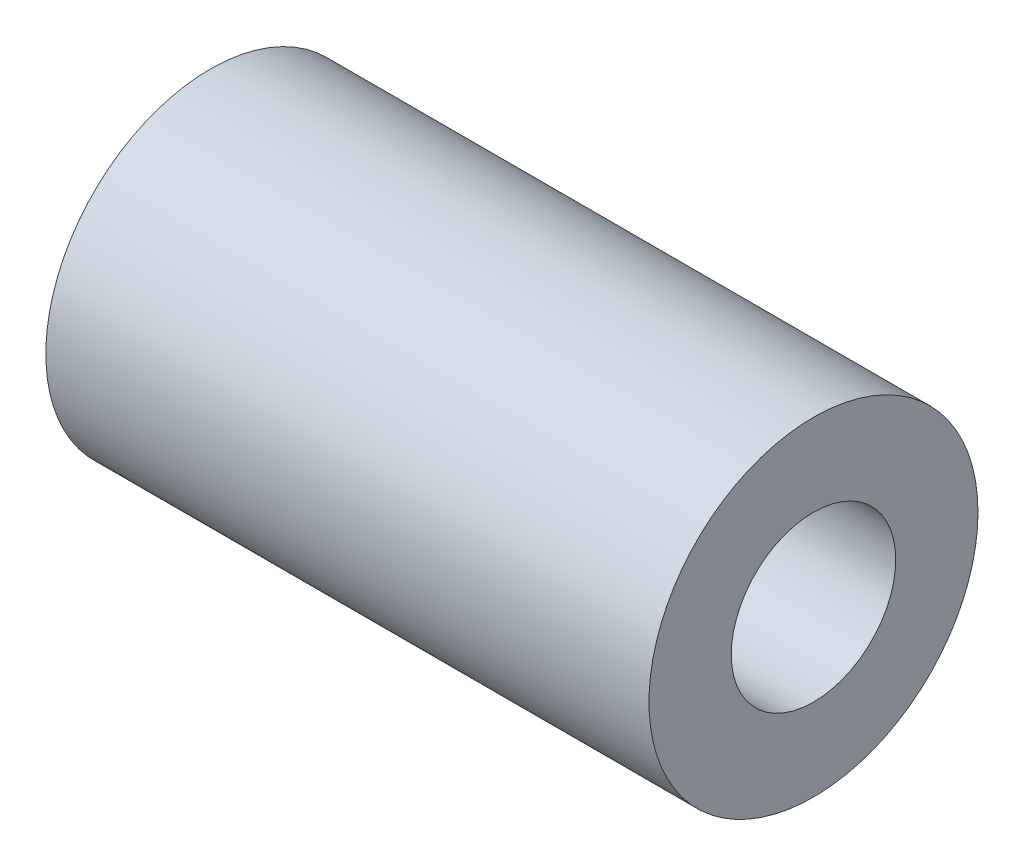
ISO-10303-21;
HEADER;
FILE_DESCRIPTION(('STEP AP214'),'2;1');
FILE_NAME('part.step','',(''),(''),'','','');
FILE_SCHEMA(('AUTOMOTIVE_DESIGN { 1 0 10303 214 1 1 1 1 }'));
ENDSEC;
DATA;
#1=APPLICATION_CONTEXT('core data for automotive mechanical design processes');
#2=APPLICATION_PROTOCOL_DEFINITION('international standard','automotive_design',2000,#1);
#3=PRODUCT_CONTEXT('',#1,'mechanical');
#4=PRODUCT('Part','Part','',(#3));
#5=PRODUCT_RELATED_PRODUCT_CATEGORY('part','',(#4));
#6=PRODUCT_DEFINITION_FORMATION('','',#4);
#7=PRODUCT_DEFINITION_CONTEXT('part definition',#1,'design');
#8=PRODUCT_DEFINITION('design','',#6,#7);
#9=PRODUCT_DEFINITION_SHAPE('','',#8);
#10=(LENGTH_UNIT() NAMED_UNIT(*) SI_UNIT(.MILLI.,.METRE.));
#11=(NAMED_UNIT(*) PLANE_ANGLE_UNIT() SI_UNIT($,.RADIAN.));
#12=(NAMED_UNIT(*) SI_UNIT($,.STERADIAN.) SOLID_ANGLE_UNIT());
#13=UNCERTAINTY_MEASURE_WITH_UNIT(LENGTH_MEASURE(1.E-05),#10,'distance_accuracy_value','');
#14=(GEOMETRIC_REPRESENTATION_CONTEXT(3) GLOBAL_UNCERTAINTY_ASSIGNED_CONTEXT((#13)) GLOBAL_UNIT_ASSIGNED_CONTEXT((#10,
#11,#12)) REPRESENTATION_CONTEXT('',''));
#15=CARTESIAN_POINT('',(0.,0.,0.));
#16=DIRECTION('',(0.,0.,1.));
#17=DIRECTION('',(1.,0.,0.));
#18=AXIS2_PLACEMENT_3D('',#15,#16,#17);
#19=CARTESIAN_POINT('',(11.,0.,0.));
#20=DIRECTION('',(1.,0.,0.));
#21=DIRECTION('',(0.,0.,-1.));
#22=AXIS2_PLACEMENT_3D('',#19,#20,#21);
#23=PLANE('',#22);
#24=CARTESIAN_POINT('',(11.,0.,0.));
#25=DIRECTION('',(1.,0.,0.));
#26=DIRECTION('',(0.,0.,-1.));
#27=AXIS2_PLACEMENT_3D('',#24,#25,#26);
#28=CIRCLE('',#27,3.);
#29=CARTESIAN_POINT('',(11.,0.,-3.));
#30=VERTEX_POINT('',#29);
#31=EDGE_CURVE('E10',#30,#30,#28,.T.);
#32=ORIENTED_EDGE('',*,*,#31,.T.);
#33=EDGE_LOOP('',(#32));
#34=FACE_BOUND('',#33,.T.);
#35=CARTESIAN_POINT('',(11.,0.,0.));
#36=DIRECTION('',(1.,0.,0.));
#37=DIRECTION('',(0.,0.,-1.));
#38=AXIS2_PLACEMENT_3D('',#35,#36,#37);
#39=CIRCLE('',#38,1.5);
#40=CARTESIAN_POINT('',(11.,0.,-1.5));
#41=VERTEX_POINT('',#40);
#42=EDGE_CURVE('E43',#41,#41,#39,.T.);
#43=ORIENTED_EDGE('',*,*,#42,.F.);
#44=EDGE_LOOP('',(#43));
#45=FACE_BOUND('',#44,.T.);
#46=ADVANCED_FACE('F32',(#34,#45),#23,.T.);
#47=CARTESIAN_POINT('',(0.,0.,0.));
#48=DIRECTION('',(1.,0.,0.));
#49=DIRECTION('',(0.,0.,-1.));
#50=AXIS2_PLACEMENT_3D('',#47,#48,#49);
#51=PLANE('',#50);
#52=CARTESIAN_POINT('',(0.,0.,0.));
#53=DIRECTION('',(1.,0.,0.));
#54=DIRECTION('',(0.,0.,-1.));
#55=AXIS2_PLACEMENT_3D('',#52,#53,#54);
#56=CIRCLE('',#55,3.);
#57=CARTESIAN_POINT('',(0.,0.,-3.));
#58=VERTEX_POINT('',#57);
#59=EDGE_CURVE('E36',#58,#58,#56,.T.);
#60=ORIENTED_EDGE('',*,*,#59,.F.);
#61=EDGE_LOOP('',(#60));
#62=FACE_BOUND('',#61,.T.);
#63=CARTESIAN_POINT('',(0.,0.,0.));
#64=DIRECTION('',(1.,0.,0.));
#65=DIRECTION('',(0.,0.,-1.));
#66=AXIS2_PLACEMENT_3D('',#63,#64,#65);
#67=CIRCLE('',#66,1.5);
#68=CARTESIAN_POINT('',(0.,0.,-1.5));
#69=VERTEX_POINT('',#68);
#70=EDGE_CURVE('E45',#69,#69,#67,.T.);
#71=ORIENTED_EDGE('',*,*,#70,.T.);
#72=EDGE_LOOP('',(#71));
#73=FACE_BOUND('',#72,.T.);
#74=ADVANCED_FACE('F55',(#62,#73),#51,.F.);
#75=CARTESIAN_POINT('',(11.,0.,0.));
#76=DIRECTION('',(-1.,0.,0.));
#77=DIRECTION('',(0.,0.,1.));
#78=AXIS2_PLACEMENT_3D('',#75,#76,#77);
#79=CYLINDRICAL_SURFACE('',#78,3.);
#80=ORIENTED_EDGE('',*,*,#31,.F.);
#81=EDGE_LOOP('',(#80));
#82=FACE_BOUND('',#81,.T.);
#83=ORIENTED_EDGE('',*,*,#59,.T.);
#84=EDGE_LOOP('',(#83));
#85=FACE_BOUND('',#84,.T.);
#86=ADVANCED_FACE('F34',(#82,#85),#79,.T.);
#87=CARTESIAN_POINT('',(11.,0.,0.));
#88=DIRECTION('',(-1.,0.,0.));
#89=DIRECTION('',(0.,0.,1.));
#90=AXIS2_PLACEMENT_3D('',#87,#88,#89);
#91=CYLINDRICAL_SURFACE('',#90,1.5);
#92=ORIENTED_EDGE('',*,*,#42,.T.);
#93=EDGE_LOOP('',(#92));
#94=FACE_BOUND('',#93,.T.);
#95=ORIENTED_EDGE('',*,*,#70,.F.);
#96=EDGE_LOOP('',(#95));
#97=FACE_BOUND('',#96,.T.);
#98=ADVANCED_FACE('F51',(#94,#97),#91,.F.);
#99=CLOSED_SHELL('',(#46,#74,#86,#98));
#100=MANIFOLD_SOLID_BREP('B2',#99);
#101=ADVANCED_BREP_SHAPE_REPRESENTATION('',(#18,#100),#14);
#102=SHAPE_DEFINITION_REPRESENTATION(#9,#101);
ENDSEC;
END-ISO-10303-21;
